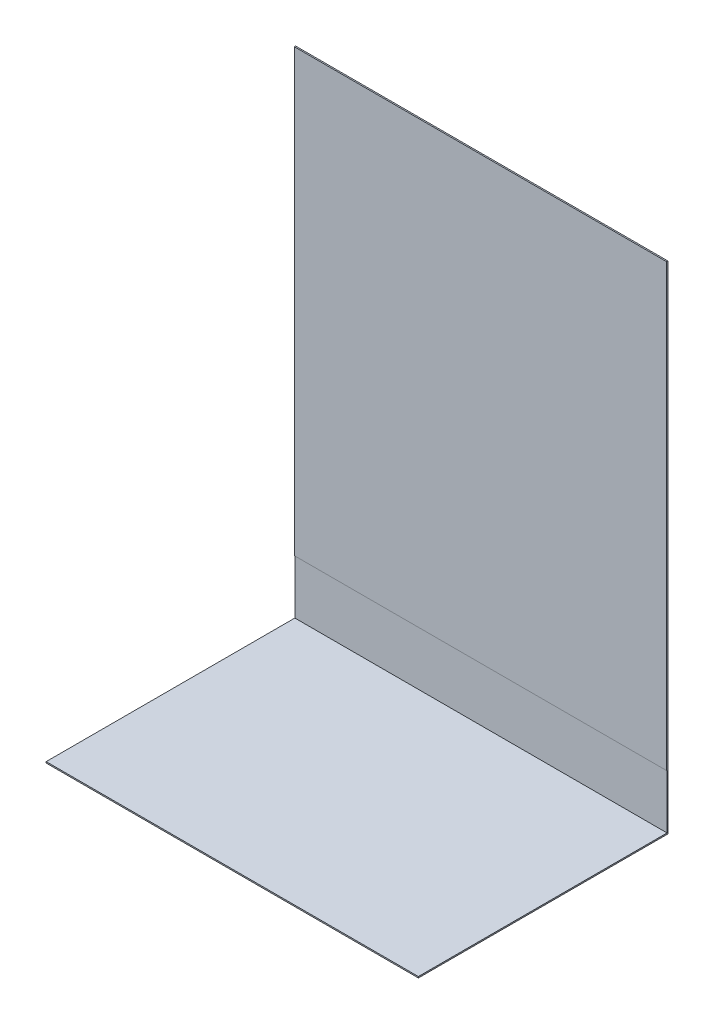
ISO-10303-21;
HEADER;
FILE_DESCRIPTION(('STEP AP214'),'2;1');
FILE_NAME('part.step','',(''),(''),'','','');
FILE_SCHEMA(('AUTOMOTIVE_DESIGN { 1 0 10303 214 1 1 1 1 }'));
ENDSEC;
DATA;
#1=APPLICATION_CONTEXT('core data for automotive mechanical design processes');
#2=APPLICATION_PROTOCOL_DEFINITION('international standard','automotive_design',2000,#1);
#3=PRODUCT_CONTEXT('',#1,'mechanical');
#4=PRODUCT('Part','Part','',(#3));
#5=PRODUCT_RELATED_PRODUCT_CATEGORY('part','',(#4));
#6=PRODUCT_DEFINITION_FORMATION('','',#4);
#7=PRODUCT_DEFINITION_CONTEXT('part definition',#1,'design');
#8=PRODUCT_DEFINITION('design','',#6,#7);
#9=PRODUCT_DEFINITION_SHAPE('','',#8);
#10=(LENGTH_UNIT() NAMED_UNIT(*) SI_UNIT(.MILLI.,.METRE.));
#11=(NAMED_UNIT(*) PLANE_ANGLE_UNIT() SI_UNIT($,.RADIAN.));
#12=(NAMED_UNIT(*) SI_UNIT($,.STERADIAN.) SOLID_ANGLE_UNIT());
#13=UNCERTAINTY_MEASURE_WITH_UNIT(LENGTH_MEASURE(1.E-05),#10,'distance_accuracy_value','');
#14=(GEOMETRIC_REPRESENTATION_CONTEXT(3) GLOBAL_UNCERTAINTY_ASSIGNED_CONTEXT((#13)) GLOBAL_UNIT_ASSIGNED_CONTEXT((#10,
#11,#12)) REPRESENTATION_CONTEXT('',''));
#15=CARTESIAN_POINT('',(0.,0.,0.));
#16=DIRECTION('',(0.,0.,1.));
#17=DIRECTION('',(1.,0.,0.));
#18=AXIS2_PLACEMENT_3D('',#15,#16,#17);
#19=CARTESIAN_POINT('',(914.4,1219.2,6.35));
#20=DIRECTION('',(-1.,0.,0.));
#21=DIRECTION('',(0.,-1.,0.));
#22=AXIS2_PLACEMENT_3D('',#19,#20,#21);
#23=PLANE('',#22);
#24=DIRECTION('',(0.,1.,0.));
#25=VECTOR('',#24,1.);
#26=CARTESIAN_POINT('',(914.4,1219.2,6.35));
#27=LINE('',#26,#25);
#28=CARTESIAN_POINT('',(914.4,-946.15,6.35));
#29=VERTEX_POINT('',#28);
#30=CARTESIAN_POINT('',(914.4,1219.2,6.35));
#31=VERTEX_POINT('',#30);
#32=EDGE_CURVE('E85',#29,#31,#27,.T.);
#33=ORIENTED_EDGE('',*,*,#32,.F.);
#34=DIRECTION('',(0.,0.,1.));
#35=VECTOR('',#34,1.);
#36=CARTESIAN_POINT('',(914.4,-946.15,3.81));
#37=LINE('',#36,#35);
#38=CARTESIAN_POINT('',(914.4,-946.15,3.81));
#39=VERTEX_POINT('',#38);
#40=EDGE_CURVE('E121',#39,#29,#37,.T.);
#41=ORIENTED_EDGE('',*,*,#40,.F.);
#42=DIRECTION('',(0.,1.,0.));
#43=VECTOR('',#42,1.);
#44=CARTESIAN_POINT('',(914.4,-1212.85,3.81));
#45=LINE('',#44,#43);
#46=CARTESIAN_POINT('',(914.4,-1212.85,3.81));
#47=VERTEX_POINT('',#46);
#48=EDGE_CURVE('E148',#47,#39,#45,.T.);
#49=ORIENTED_EDGE('',*,*,#48,.F.);
#50=DIRECTION('',(0.,0.,-1.));
#51=VECTOR('',#50,1.);
#52=CARTESIAN_POINT('',(914.4,-1212.85,1225.55));
#53=LINE('',#52,#51);
#54=CARTESIAN_POINT('',(914.4,-1212.85,1225.55));
#55=VERTEX_POINT('',#54);
#56=EDGE_CURVE('E100',#55,#47,#53,.T.);
#57=ORIENTED_EDGE('',*,*,#56,.F.);
#58=DIRECTION('',(0.,1.,0.));
#59=VECTOR('',#58,1.);
#60=CARTESIAN_POINT('',(914.4,-1219.2,1225.55));
#61=LINE('',#60,#59);
#62=CARTESIAN_POINT('',(914.4,-1219.2,1225.55));
#63=VERTEX_POINT('',#62);
#64=EDGE_CURVE('E95',#63,#55,#61,.T.);
#65=ORIENTED_EDGE('',*,*,#64,.F.);
#66=DIRECTION('',(0.,0.,-1.));
#67=VECTOR('',#66,1.);
#68=CARTESIAN_POINT('',(914.4,-1219.2,6.35));
#69=LINE('',#68,#67);
#70=CARTESIAN_POINT('',(914.4,-1219.2,0.));
#71=VERTEX_POINT('',#70);
#72=EDGE_CURVE('E80',#63,#71,#69,.T.);
#73=ORIENTED_EDGE('',*,*,#72,.T.);
#74=DIRECTION('',(0.,1.,0.));
#75=VECTOR('',#74,1.);
#76=CARTESIAN_POINT('',(914.4,1219.2,0.));
#77=LINE('',#76,#75);
#78=CARTESIAN_POINT('',(914.4,1219.2,0.));
#79=VERTEX_POINT('',#78);
#80=EDGE_CURVE('E92',#71,#79,#77,.T.);
#81=ORIENTED_EDGE('',*,*,#80,.T.);
#82=DIRECTION('',(0.,0.,-1.));
#83=VECTOR('',#82,1.);
#84=CARTESIAN_POINT('',(914.4,1219.2,6.35));
#85=LINE('',#84,#83);
#86=EDGE_CURVE('E11',#31,#79,#85,.T.);
#87=ORIENTED_EDGE('',*,*,#86,.F.);
#88=EDGE_LOOP('',(#33,#41,#49,#57,#65,#73,#81,#87));
#89=FACE_BOUND('',#88,.T.);
#90=ADVANCED_FACE('F36',(#89),#23,.F.);
#91=CARTESIAN_POINT('',(-914.4,1219.2,6.35));
#92=DIRECTION('',(0.,-1.,0.));
#93=DIRECTION('',(0.,0.,-1.));
#94=AXIS2_PLACEMENT_3D('',#91,#92,#93);
#95=PLANE('',#94);
#96=DIRECTION('',(-1.,0.,0.));
#97=VECTOR('',#96,1.);
#98=CARTESIAN_POINT('',(-914.4,1219.2,0.));
#99=LINE('',#98,#97);
#100=CARTESIAN_POINT('',(-914.4,1219.2,0.));
#101=VERTEX_POINT('',#100);
#102=EDGE_CURVE('E99',#79,#101,#99,.T.);
#103=ORIENTED_EDGE('',*,*,#102,.T.);
#104=DIRECTION('',(0.,0.,-1.));
#105=VECTOR('',#104,1.);
#106=CARTESIAN_POINT('',(-914.4,1219.2,6.35));
#107=LINE('',#106,#105);
#108=CARTESIAN_POINT('',(-914.4,1219.2,6.35));
#109=VERTEX_POINT('',#108);
#110=EDGE_CURVE('E44',#109,#101,#107,.T.);
#111=ORIENTED_EDGE('',*,*,#110,.F.);
#112=DIRECTION('',(-1.,0.,0.));
#113=VECTOR('',#112,1.);
#114=CARTESIAN_POINT('',(-914.4,1219.2,6.35));
#115=LINE('',#114,#113);
#116=EDGE_CURVE('E52',#31,#109,#115,.T.);
#117=ORIENTED_EDGE('',*,*,#116,.F.);
#118=ORIENTED_EDGE('',*,*,#86,.T.);
#119=EDGE_LOOP('',(#103,#111,#117,#118));
#120=FACE_BOUND('',#119,.T.);
#121=ADVANCED_FACE('F115',(#120),#95,.F.);
#122=CARTESIAN_POINT('',(-914.4,1219.2,6.35));
#123=DIRECTION('',(1.,0.,0.));
#124=DIRECTION('',(0.,1.,0.));
#125=AXIS2_PLACEMENT_3D('',#122,#123,#124);
#126=PLANE('',#125);
#127=DIRECTION('',(0.,-1.,0.));
#128=VECTOR('',#127,1.);
#129=CARTESIAN_POINT('',(-914.4,-1212.85,3.81));
#130=LINE('',#129,#128);
#131=CARTESIAN_POINT('',(-914.4,-946.15,3.81));
#132=VERTEX_POINT('',#131);
#133=CARTESIAN_POINT('',(-914.4,-1212.85,3.81));
#134=VERTEX_POINT('',#133);
#135=EDGE_CURVE('E145',#132,#134,#130,.T.);
#136=ORIENTED_EDGE('',*,*,#135,.F.);
#137=DIRECTION('',(0.,0.,1.));
#138=VECTOR('',#137,1.);
#139=CARTESIAN_POINT('',(-914.4,-946.15,3.81));
#140=LINE('',#139,#138);
#141=CARTESIAN_POINT('',(-914.4,-946.15,6.35));
#142=VERTEX_POINT('',#141);
#143=EDGE_CURVE('E138',#132,#142,#140,.T.);
#144=ORIENTED_EDGE('',*,*,#143,.T.);
#145=DIRECTION('',(0.,-1.,0.));
#146=VECTOR('',#145,1.);
#147=CARTESIAN_POINT('',(-914.4,1219.2,6.35));
#148=LINE('',#147,#146);
#149=EDGE_CURVE('E96',#109,#142,#148,.T.);
#150=ORIENTED_EDGE('',*,*,#149,.F.);
#151=ORIENTED_EDGE('',*,*,#110,.T.);
#152=DIRECTION('',(0.,-1.,0.));
#153=VECTOR('',#152,1.);
#154=CARTESIAN_POINT('',(-914.4,1219.2,0.));
#155=LINE('',#154,#153);
#156=CARTESIAN_POINT('',(-914.4,-1219.2,0.));
#157=VERTEX_POINT('',#156);
#158=EDGE_CURVE('E69',#101,#157,#155,.T.);
#159=ORIENTED_EDGE('',*,*,#158,.T.);
#160=DIRECTION('',(0.,0.,-1.));
#161=VECTOR('',#160,1.);
#162=CARTESIAN_POINT('',(-914.4,-1219.2,6.35));
#163=LINE('',#162,#161);
#164=CARTESIAN_POINT('',(-914.4,-1219.2,1225.55));
#165=VERTEX_POINT('',#164);
#166=EDGE_CURVE('E82',#165,#157,#163,.T.);
#167=ORIENTED_EDGE('',*,*,#166,.F.);
#168=DIRECTION('',(0.,-1.,0.));
#169=VECTOR('',#168,1.);
#170=CARTESIAN_POINT('',(-914.4,-1219.2,1225.55));
#171=LINE('',#170,#169);
#172=CARTESIAN_POINT('',(-914.4,-1212.85,1225.55));
#173=VERTEX_POINT('',#172);
#174=EDGE_CURVE('E135',#173,#165,#171,.T.);
#175=ORIENTED_EDGE('',*,*,#174,.F.);
#176=DIRECTION('',(0.,0.,-1.));
#177=VECTOR('',#176,1.);
#178=CARTESIAN_POINT('',(-914.4,-1212.85,1225.55));
#179=LINE('',#178,#177);
#180=EDGE_CURVE('E104',#173,#134,#179,.T.);
#181=ORIENTED_EDGE('',*,*,#180,.T.);
#182=EDGE_LOOP('',(#136,#144,#150,#151,#159,#167,#175,#181));
#183=FACE_BOUND('',#182,.T.);
#184=ADVANCED_FACE('F112',(#183),#126,.F.);
#185=CARTESIAN_POINT('',(-914.4,-1219.2,6.35));
#186=DIRECTION('',(0.,1.,0.));
#187=DIRECTION('',(0.,0.,1.));
#188=AXIS2_PLACEMENT_3D('',#185,#186,#187);
#189=PLANE('',#188);
#190=DIRECTION('',(1.,0.,0.));
#191=VECTOR('',#190,1.);
#192=CARTESIAN_POINT('',(-914.4,-1219.2,0.));
#193=LINE('',#192,#191);
#194=EDGE_CURVE('E75',#157,#71,#193,.T.);
#195=ORIENTED_EDGE('',*,*,#194,.T.);
#196=ORIENTED_EDGE('',*,*,#72,.F.);
#197=DIRECTION('',(1.,0.,0.));
#198=VECTOR('',#197,1.);
#199=CARTESIAN_POINT('',(-914.4,-1219.2,1225.55));
#200=LINE('',#199,#198);
#201=EDGE_CURVE('E133',#165,#63,#200,.T.);
#202=ORIENTED_EDGE('',*,*,#201,.F.);
#203=ORIENTED_EDGE('',*,*,#166,.T.);
#204=EDGE_LOOP('',(#195,#196,#202,#203));
#205=FACE_BOUND('',#204,.T.);
#206=ADVANCED_FACE('F77',(#205),#189,.F.);
#207=CARTESIAN_POINT('',(0.,0.,6.35));
#208=DIRECTION('',(0.,0.,1.));
#209=DIRECTION('',(1.,0.,0.));
#210=AXIS2_PLACEMENT_3D('',#207,#208,#209);
#211=PLANE('',#210);
#212=DIRECTION('',(-1.,0.,0.));
#213=VECTOR('',#212,1.);
#214=CARTESIAN_POINT('',(-914.4,-946.15,6.35));
#215=LINE('',#214,#213);
#216=EDGE_CURVE('E142',#29,#142,#215,.T.);
#217=ORIENTED_EDGE('',*,*,#216,.F.);
#218=ORIENTED_EDGE('',*,*,#32,.T.);
#219=ORIENTED_EDGE('',*,*,#116,.T.);
#220=ORIENTED_EDGE('',*,*,#149,.T.);
#221=EDGE_LOOP('',(#217,#218,#219,#220));
#222=FACE_BOUND('',#221,.T.);
#223=ADVANCED_FACE('F182',(#222),#211,.T.);
#224=CARTESIAN_POINT('',(0.,0.,0.));
#225=DIRECTION('',(0.,0.,1.));
#226=DIRECTION('',(1.,0.,0.));
#227=AXIS2_PLACEMENT_3D('',#224,#225,#226);
#228=PLANE('',#227);
#229=ORIENTED_EDGE('',*,*,#80,.F.);
#230=ORIENTED_EDGE('',*,*,#194,.F.);
#231=ORIENTED_EDGE('',*,*,#158,.F.);
#232=ORIENTED_EDGE('',*,*,#102,.F.);
#233=EDGE_LOOP('',(#229,#230,#231,#232));
#234=FACE_BOUND('',#233,.T.);
#235=ADVANCED_FACE('F98',(#234),#228,.F.);
#236=CARTESIAN_POINT('',(-914.4,-1212.85,1225.55));
#237=DIRECTION('',(0.,-1.,0.));
#238=DIRECTION('',(0.,0.,-1.));
#239=AXIS2_PLACEMENT_3D('',#236,#237,#238);
#240=PLANE('',#239);
#241=ORIENTED_EDGE('',*,*,#56,.T.);
#242=DIRECTION('',(1.,0.,0.));
#243=VECTOR('',#242,1.);
#244=CARTESIAN_POINT('',(-914.4,-1212.85,3.81));
#245=LINE('',#244,#243);
#246=EDGE_CURVE('E151',#134,#47,#245,.T.);
#247=ORIENTED_EDGE('',*,*,#246,.F.);
#248=ORIENTED_EDGE('',*,*,#180,.F.);
#249=DIRECTION('',(-1.,0.,0.));
#250=VECTOR('',#249,1.);
#251=CARTESIAN_POINT('',(-914.4,-1212.85,1225.55));
#252=LINE('',#251,#250);
#253=EDGE_CURVE('E129',#55,#173,#252,.T.);
#254=ORIENTED_EDGE('',*,*,#253,.F.);
#255=EDGE_LOOP('',(#241,#247,#248,#254));
#256=FACE_BOUND('',#255,.T.);
#257=ADVANCED_FACE('F180',(#256),#240,.F.);
#258=CARTESIAN_POINT('',(0.,0.,1225.55));
#259=DIRECTION('',(0.,0.,-1.));
#260=DIRECTION('',(-1.,0.,0.));
#261=AXIS2_PLACEMENT_3D('',#258,#259,#260);
#262=PLANE('',#261);
#263=ORIENTED_EDGE('',*,*,#174,.T.);
#264=ORIENTED_EDGE('',*,*,#201,.T.);
#265=ORIENTED_EDGE('',*,*,#64,.T.);
#266=ORIENTED_EDGE('',*,*,#253,.T.);
#267=EDGE_LOOP('',(#263,#264,#265,#266));
#268=FACE_BOUND('',#267,.T.);
#269=ADVANCED_FACE('F178',(#268),#262,.F.);
#270=CARTESIAN_POINT('',(-914.4,-946.15,3.81));
#271=DIRECTION('',(0.,1.,0.));
#272=DIRECTION('',(0.,0.,1.));
#273=AXIS2_PLACEMENT_3D('',#270,#271,#272);
#274=PLANE('',#273);
#275=ORIENTED_EDGE('',*,*,#216,.T.);
#276=ORIENTED_EDGE('',*,*,#143,.F.);
#277=DIRECTION('',(-1.,0.,0.));
#278=VECTOR('',#277,1.);
#279=CARTESIAN_POINT('',(-914.4,-946.15,3.81));
#280=LINE('',#279,#278);
#281=EDGE_CURVE('E140',#39,#132,#280,.T.);
#282=ORIENTED_EDGE('',*,*,#281,.F.);
#283=ORIENTED_EDGE('',*,*,#40,.T.);
#284=EDGE_LOOP('',(#275,#276,#282,#283));
#285=FACE_BOUND('',#284,.T.);
#286=ADVANCED_FACE('F181',(#285),#274,.F.);
#287=CARTESIAN_POINT('',(0.,0.,3.81));
#288=DIRECTION('',(0.,0.,-1.));
#289=DIRECTION('',(-1.,0.,0.));
#290=AXIS2_PLACEMENT_3D('',#287,#288,#289);
#291=PLANE('',#290);
#292=ORIENTED_EDGE('',*,*,#135,.T.);
#293=ORIENTED_EDGE('',*,*,#246,.T.);
#294=ORIENTED_EDGE('',*,*,#48,.T.);
#295=ORIENTED_EDGE('',*,*,#281,.T.);
#296=EDGE_LOOP('',(#292,#293,#294,#295));
#297=FACE_BOUND('',#296,.T.);
#298=ADVANCED_FACE('F157',(#297),#291,.F.);
#299=CLOSED_SHELL('',(#90,#121,#184,#206,#223,#235,#257,#269,#286,#298));
#300=MANIFOLD_SOLID_BREP('B2',#299);
#301=ADVANCED_BREP_SHAPE_REPRESENTATION('',(#18,#300),#14);
#302=SHAPE_DEFINITION_REPRESENTATION(#9,#301);
ENDSEC;
END-ISO-10303-21;
